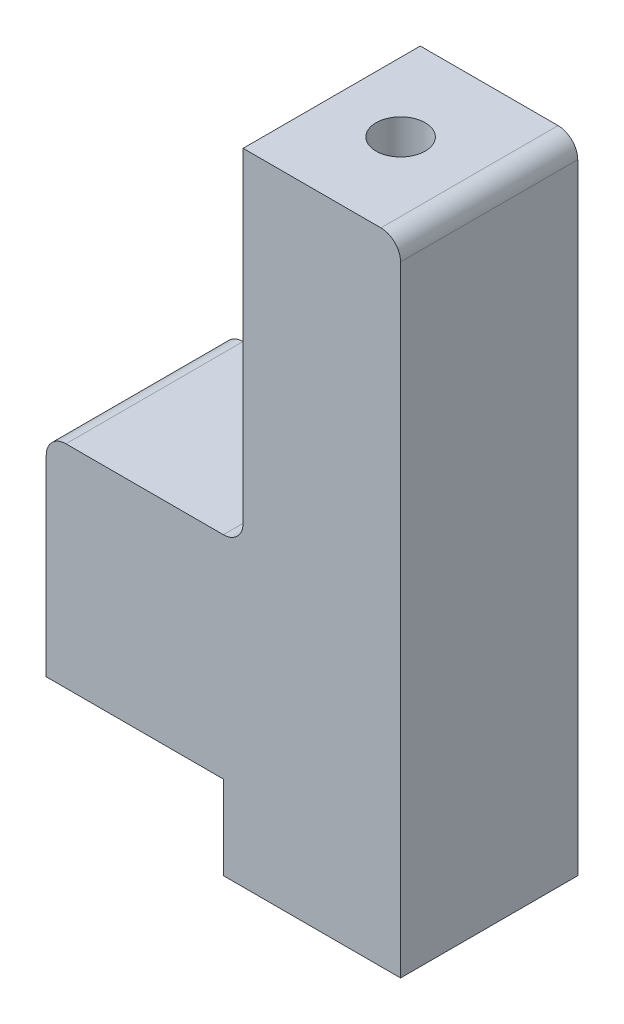
ISO-10303-21;
HEADER;
FILE_DESCRIPTION(('STEP AP214'),'2;1');
FILE_NAME('part.step','',(''),(''),'','','');
FILE_SCHEMA(('AUTOMOTIVE_DESIGN { 1 0 10303 214 1 1 1 1 }'));
ENDSEC;
DATA;
#1=APPLICATION_CONTEXT('core data for automotive mechanical design processes');
#2=APPLICATION_PROTOCOL_DEFINITION('international standard','automotive_design',2000,#1);
#3=PRODUCT_CONTEXT('',#1,'mechanical');
#4=PRODUCT('Part','Part','',(#3));
#5=PRODUCT_RELATED_PRODUCT_CATEGORY('part','',(#4));
#6=PRODUCT_DEFINITION_FORMATION('','',#4);
#7=PRODUCT_DEFINITION_CONTEXT('part definition',#1,'design');
#8=PRODUCT_DEFINITION('design','',#6,#7);
#9=PRODUCT_DEFINITION_SHAPE('','',#8);
#10=(LENGTH_UNIT() NAMED_UNIT(*) SI_UNIT(.MILLI.,.METRE.));
#11=(NAMED_UNIT(*) PLANE_ANGLE_UNIT() SI_UNIT($,.RADIAN.));
#12=(NAMED_UNIT(*) SI_UNIT($,.STERADIAN.) SOLID_ANGLE_UNIT());
#13=UNCERTAINTY_MEASURE_WITH_UNIT(LENGTH_MEASURE(1.E-05),#10,'distance_accuracy_value','');
#14=(GEOMETRIC_REPRESENTATION_CONTEXT(3) GLOBAL_UNCERTAINTY_ASSIGNED_CONTEXT((#13)) GLOBAL_UNIT_ASSIGNED_CONTEXT((#10,
#11,#12)) REPRESENTATION_CONTEXT('',''));
#15=CARTESIAN_POINT('',(0.,0.,0.));
#16=DIRECTION('',(0.,0.,1.));
#17=DIRECTION('',(1.,0.,0.));
#18=AXIS2_PLACEMENT_3D('',#15,#16,#17);
#19=CARTESIAN_POINT('',(-4.5,15.,4.5));
#20=DIRECTION('',(1.,0.,0.));
#21=DIRECTION('',(0.,0.,-1.));
#22=AXIS2_PLACEMENT_3D('',#19,#20,#21);
#23=PLANE('',#22);
#24=DIRECTION('',(0.,-1.,0.));
#25=VECTOR('',#24,1.);
#26=CARTESIAN_POINT('',(-4.5,15.,4.5));
#27=LINE('',#26,#25);
#28=CARTESIAN_POINT('',(-4.5,9.,4.5));
#29=VERTEX_POINT('',#28);
#30=CARTESIAN_POINT('',(-4.5,-0.75,4.5));
#31=VERTEX_POINT('',#30);
#32=EDGE_CURVE('E212',#29,#31,#27,.T.);
#33=ORIENTED_EDGE('',*,*,#32,.F.);
#34=DIRECTION('',(0.,0.,1.));
#35=VECTOR('',#34,1.);
#36=CARTESIAN_POINT('',(-4.5,9.,-4.5));
#37=LINE('',#36,#35);
#38=CARTESIAN_POINT('',(-4.5,9.,-4.5));
#39=VERTEX_POINT('',#38);
#40=EDGE_CURVE('E225',#29,#39,#37,.F.);
#41=ORIENTED_EDGE('',*,*,#40,.T.);
#42=DIRECTION('',(0.,-1.,0.));
#43=VECTOR('',#42,1.);
#44=CARTESIAN_POINT('',(-4.5,15.,-4.5));
#45=LINE('',#44,#43);
#46=CARTESIAN_POINT('',(-4.5,0.,-4.5));
#47=VERTEX_POINT('',#46);
#48=EDGE_CURVE('E214',#39,#47,#45,.T.);
#49=ORIENTED_EDGE('',*,*,#48,.T.);
#50=DIRECTION('',(0.,0.,1.));
#51=VECTOR('',#50,1.);
#52=CARTESIAN_POINT('',(-4.5,0.,4.5));
#53=LINE('',#52,#51);
#54=CARTESIAN_POINT('',(-4.5,0.,3.75));
#55=VERTEX_POINT('',#54);
#56=EDGE_CURVE('E209',#47,#55,#53,.T.);
#57=ORIENTED_EDGE('',*,*,#56,.T.);
#58=CARTESIAN_POINT('',(-4.5,-0.75,3.75));
#59=DIRECTION('',(-1.,0.,0.));
#60=DIRECTION('',(0.,0.,1.));
#61=AXIS2_PLACEMENT_3D('',#58,#59,#60);
#62=CIRCLE('',#61,0.75);
#63=EDGE_CURVE('E164',#31,#55,#62,.T.);
#64=ORIENTED_EDGE('',*,*,#63,.F.);
#65=EDGE_LOOP('',(#33,#41,#49,#57,#64));
#66=FACE_BOUND('',#65,.T.);
#67=ADVANCED_FACE('F37',(#66),#23,.F.);
#68=CARTESIAN_POINT('',(0.,0.,0.));
#69=DIRECTION('',(0.,-1.,0.));
#70=DIRECTION('',(0.,0.,-1.));
#71=AXIS2_PLACEMENT_3D('',#68,#69,#70);
#72=PLANE('',#71);
#73=DIRECTION('',(0.,0.,-1.));
#74=VECTOR('',#73,1.);
#75=CARTESIAN_POINT('',(4.5,0.,4.5));
#76=LINE('',#75,#74);
#77=CARTESIAN_POINT('',(4.5,0.,3.75));
#78=VERTEX_POINT('',#77);
#79=CARTESIAN_POINT('',(4.5,0.,-4.5));
#80=VERTEX_POINT('',#79);
#81=EDGE_CURVE('E202',#78,#80,#76,.T.);
#82=ORIENTED_EDGE('',*,*,#81,.F.);
#83=DIRECTION('',(-1.,0.,0.));
#84=VECTOR('',#83,1.);
#85=CARTESIAN_POINT('',(5.56066017177982,0.,3.75));
#86=LINE('',#85,#84);
#87=CARTESIAN_POINT('',(0.,0.,3.75));
#88=VERTEX_POINT('',#87);
#89=EDGE_CURVE('E169',#78,#88,#86,.T.);
#90=ORIENTED_EDGE('',*,*,#89,.T.);
#91=CARTESIAN_POINT('',(0.,0.,0.));
#92=DIRECTION('',(0.,-1.,0.));
#93=DIRECTION('',(0.,0.,-1.));
#94=AXIS2_PLACEMENT_3D('',#91,#92,#93);
#95=CIRCLE('',#94,3.75);
#96=EDGE_CURVE('E192',#88,#88,#95,.T.);
#97=ORIENTED_EDGE('',*,*,#96,.F.);
#98=EDGE_CURVE('E174',#88,#55,#86,.T.);
#99=ORIENTED_EDGE('',*,*,#98,.T.);
#100=ORIENTED_EDGE('',*,*,#56,.F.);
#101=DIRECTION('',(-1.,0.,0.));
#102=VECTOR('',#101,1.);
#103=CARTESIAN_POINT('',(-4.5,0.,-4.5));
#104=LINE('',#103,#102);
#105=EDGE_CURVE('E206',#80,#47,#104,.T.);
#106=ORIENTED_EDGE('',*,*,#105,.F.);
#107=EDGE_LOOP('',(#82,#90,#97,#99,#100,#106));
#108=FACE_BOUND('',#107,.T.);
#109=ADVANCED_FACE('F261',(#108),#72,.T.);
#110=CARTESIAN_POINT('',(4.5,-5.,-4.5));
#111=DIRECTION('',(-1.,0.,0.));
#112=DIRECTION('',(0.,0.,1.));
#113=AXIS2_PLACEMENT_3D('',#110,#111,#112);
#114=PLANE('',#113);
#115=DIRECTION('',(0.,1.,0.));
#116=VECTOR('',#115,1.);
#117=CARTESIAN_POINT('',(4.5,-5.,4.5));
#118=LINE('',#117,#116);
#119=CARTESIAN_POINT('',(4.5,-5.,4.5));
#120=VERTEX_POINT('',#119);
#121=CARTESIAN_POINT('',(4.5,-0.75,4.5));
#122=VERTEX_POINT('',#121);
#123=EDGE_CURVE('E188',#120,#122,#118,.T.);
#124=ORIENTED_EDGE('',*,*,#123,.T.);
#125=CARTESIAN_POINT('',(4.5,-0.75,3.75));
#126=DIRECTION('',(-1.,0.,0.));
#127=DIRECTION('',(0.,0.,1.));
#128=AXIS2_PLACEMENT_3D('',#125,#126,#127);
#129=CIRCLE('',#128,0.75);
#130=EDGE_CURVE('E166',#78,#122,#129,.F.);
#131=ORIENTED_EDGE('',*,*,#130,.F.);
#132=ORIENTED_EDGE('',*,*,#81,.T.);
#133=DIRECTION('',(0.,1.,0.));
#134=VECTOR('',#133,1.);
#135=CARTESIAN_POINT('',(4.5,-5.,-4.5));
#136=LINE('',#135,#134);
#137=CARTESIAN_POINT('',(4.5,-5.,-4.5));
#138=VERTEX_POINT('',#137);
#139=EDGE_CURVE('E189',#138,#80,#136,.T.);
#140=ORIENTED_EDGE('',*,*,#139,.F.);
#141=DIRECTION('',(0.,0.,1.));
#142=VECTOR('',#141,1.);
#143=CARTESIAN_POINT('',(4.5,-5.,-4.5));
#144=LINE('',#143,#142);
#145=EDGE_CURVE('E168',#138,#120,#144,.T.);
#146=ORIENTED_EDGE('',*,*,#145,.T.);
#147=EDGE_LOOP('',(#124,#131,#132,#140,#146));
#148=FACE_BOUND('',#147,.T.);
#149=ADVANCED_FACE('F284',(#148),#114,.T.);
#150=CARTESIAN_POINT('',(-4.5,15.,-4.5));
#151=DIRECTION('',(0.,0.,1.));
#152=DIRECTION('',(1.,0.,0.));
#153=AXIS2_PLACEMENT_3D('',#150,#151,#152);
#154=PLANE('',#153);
#155=DIRECTION('',(-1.,0.,0.));
#156=VECTOR('',#155,1.);
#157=CARTESIAN_POINT('',(5.5,27.5,-4.5));
#158=LINE('',#157,#156);
#159=CARTESIAN_POINT('',(12.5,27.5,-4.5));
#160=VERTEX_POINT('',#159);
#161=CARTESIAN_POINT('',(5.5,27.5,-4.5));
#162=VERTEX_POINT('',#161);
#163=EDGE_CURVE('E147',#160,#162,#158,.T.);
#164=ORIENTED_EDGE('',*,*,#163,.F.);
#165=CARTESIAN_POINT('',(12.5,26.5,-4.5));
#166=DIRECTION('',(0.,0.,1.));
#167=DIRECTION('',(1.,0.,0.));
#168=AXIS2_PLACEMENT_3D('',#165,#166,#167);
#169=CIRCLE('',#168,1.);
#170=CARTESIAN_POINT('',(13.5,26.5,-4.5));
#171=VERTEX_POINT('',#170);
#172=EDGE_CURVE('E59',#160,#171,#169,.F.);
#173=ORIENTED_EDGE('',*,*,#172,.T.);
#174=DIRECTION('',(0.,1.,0.));
#175=VECTOR('',#174,1.);
#176=CARTESIAN_POINT('',(13.5,-5.,-4.5));
#177=LINE('',#176,#175);
#178=CARTESIAN_POINT('',(13.5,-5.,-4.5));
#179=VERTEX_POINT('',#178);
#180=EDGE_CURVE('E193',#179,#171,#177,.T.);
#181=ORIENTED_EDGE('',*,*,#180,.F.);
#182=DIRECTION('',(-1.,0.,0.));
#183=VECTOR('',#182,1.);
#184=CARTESIAN_POINT('',(4.5,-5.,-4.5));
#185=LINE('',#184,#183);
#186=EDGE_CURVE('E185',#179,#138,#185,.T.);
#187=ORIENTED_EDGE('',*,*,#186,.T.);
#188=ORIENTED_EDGE('',*,*,#139,.T.);
#189=ORIENTED_EDGE('',*,*,#105,.T.);
#190=ORIENTED_EDGE('',*,*,#48,.F.);
#191=CARTESIAN_POINT('',(-3.5,9.,-4.5));
#192=DIRECTION('',(0.,0.,1.));
#193=DIRECTION('',(1.,0.,0.));
#194=AXIS2_PLACEMENT_3D('',#191,#192,#193);
#195=CIRCLE('',#194,1.);
#196=CARTESIAN_POINT('',(-3.5,10.,-4.5));
#197=VERTEX_POINT('',#196);
#198=EDGE_CURVE('E227',#39,#197,#195,.F.);
#199=ORIENTED_EDGE('',*,*,#198,.T.);
#200=DIRECTION('',(-1.,0.,0.));
#201=VECTOR('',#200,1.);
#202=CARTESIAN_POINT('',(-4.5,10.,-4.5));
#203=LINE('',#202,#201);
#204=CARTESIAN_POINT('',(4.5,10.,-4.5));
#205=VERTEX_POINT('',#204);
#206=EDGE_CURVE('E138',#205,#197,#203,.T.);
#207=ORIENTED_EDGE('',*,*,#206,.F.);
#208=CARTESIAN_POINT('',(4.5,11.,-4.5));
#209=DIRECTION('',(0.,0.,1.));
#210=DIRECTION('',(1.,0.,0.));
#211=AXIS2_PLACEMENT_3D('',#208,#209,#210);
#212=CIRCLE('',#211,1.);
#213=CARTESIAN_POINT('',(5.5,11.,-4.5));
#214=VERTEX_POINT('',#213);
#215=EDGE_CURVE('E229',#205,#214,#212,.T.);
#216=ORIENTED_EDGE('',*,*,#215,.T.);
#217=DIRECTION('',(0.,1.,0.));
#218=VECTOR('',#217,1.);
#219=CARTESIAN_POINT('',(5.5,10.,-4.5));
#220=LINE('',#219,#218);
#221=EDGE_CURVE('E137',#214,#162,#220,.T.);
#222=ORIENTED_EDGE('',*,*,#221,.T.);
#223=EDGE_LOOP('',(#164,#173,#181,#187,#188,#189,#190,#199,#207,#216,#222));
#224=FACE_BOUND('',#223,.T.);
#225=ADVANCED_FACE('F236',(#224),#154,.F.);
#226=CARTESIAN_POINT('',(-4.5,15.,4.5));
#227=DIRECTION('',(0.,0.,-1.));
#228=DIRECTION('',(-1.,0.,0.));
#229=AXIS2_PLACEMENT_3D('',#226,#227,#228);
#230=PLANE('',#229);
#231=DIRECTION('',(0.,1.,0.));
#232=VECTOR('',#231,1.);
#233=CARTESIAN_POINT('',(13.5,-5.,4.5));
#234=LINE('',#233,#232);
#235=CARTESIAN_POINT('',(13.5,-5.,4.5));
#236=VERTEX_POINT('',#235);
#237=CARTESIAN_POINT('',(13.5,26.5,4.5));
#238=VERTEX_POINT('',#237);
#239=EDGE_CURVE('E195',#236,#238,#234,.T.);
#240=ORIENTED_EDGE('',*,*,#239,.T.);
#241=CARTESIAN_POINT('',(12.5,26.5,4.5));
#242=DIRECTION('',(0.,0.,-1.));
#243=DIRECTION('',(-1.,0.,0.));
#244=AXIS2_PLACEMENT_3D('',#241,#242,#243);
#245=CIRCLE('',#244,1.);
#246=CARTESIAN_POINT('',(12.5,27.5,4.5));
#247=VERTEX_POINT('',#246);
#248=EDGE_CURVE('E11',#238,#247,#245,.F.);
#249=ORIENTED_EDGE('',*,*,#248,.T.);
#250=DIRECTION('',(1.,0.,0.));
#251=VECTOR('',#250,1.);
#252=CARTESIAN_POINT('',(5.5,27.5,4.5));
#253=LINE('',#252,#251);
#254=CARTESIAN_POINT('',(5.5,27.5,4.5));
#255=VERTEX_POINT('',#254);
#256=EDGE_CURVE('E141',#255,#247,#253,.T.);
#257=ORIENTED_EDGE('',*,*,#256,.F.);
#258=DIRECTION('',(0.,1.,0.));
#259=VECTOR('',#258,1.);
#260=CARTESIAN_POINT('',(5.5,10.,4.5));
#261=LINE('',#260,#259);
#262=CARTESIAN_POINT('',(5.5,11.,4.5));
#263=VERTEX_POINT('',#262);
#264=EDGE_CURVE('E127',#263,#255,#261,.T.);
#265=ORIENTED_EDGE('',*,*,#264,.F.);
#266=CARTESIAN_POINT('',(4.5,11.,4.5));
#267=DIRECTION('',(0.,0.,-1.));
#268=DIRECTION('',(-1.,0.,0.));
#269=AXIS2_PLACEMENT_3D('',#266,#267,#268);
#270=CIRCLE('',#269,1.);
#271=CARTESIAN_POINT('',(4.5,10.,4.5));
#272=VERTEX_POINT('',#271);
#273=EDGE_CURVE('E231',#263,#272,#270,.T.);
#274=ORIENTED_EDGE('',*,*,#273,.T.);
#275=DIRECTION('',(1.,0.,0.));
#276=VECTOR('',#275,1.);
#277=CARTESIAN_POINT('',(-4.5,10.,4.5));
#278=LINE('',#277,#276);
#279=CARTESIAN_POINT('',(-3.5,10.,4.5));
#280=VERTEX_POINT('',#279);
#281=EDGE_CURVE('E159',#280,#272,#278,.T.);
#282=ORIENTED_EDGE('',*,*,#281,.F.);
#283=CARTESIAN_POINT('',(-3.5,9.,4.5));
#284=DIRECTION('',(0.,0.,-1.));
#285=DIRECTION('',(-1.,0.,0.));
#286=AXIS2_PLACEMENT_3D('',#283,#284,#285);
#287=CIRCLE('',#286,1.);
#288=EDGE_CURVE('E223',#280,#29,#287,.F.);
#289=ORIENTED_EDGE('',*,*,#288,.T.);
#290=ORIENTED_EDGE('',*,*,#32,.T.);
#291=DIRECTION('',(-1.,0.,0.));
#292=VECTOR('',#291,1.);
#293=CARTESIAN_POINT('',(5.56066017177982,-0.75,4.5));
#294=LINE('',#293,#292);
#295=EDGE_CURVE('E171',#122,#31,#294,.T.);
#296=ORIENTED_EDGE('',*,*,#295,.F.);
#297=ORIENTED_EDGE('',*,*,#123,.F.);
#298=DIRECTION('',(1.,0.,0.));
#299=VECTOR('',#298,1.);
#300=CARTESIAN_POINT('',(4.5,-5.,4.5));
#301=LINE('',#300,#299);
#302=EDGE_CURVE('E179',#120,#236,#301,.T.);
#303=ORIENTED_EDGE('',*,*,#302,.T.);
#304=EDGE_LOOP('',(#240,#249,#257,#265,#274,#282,#289,#290,#296,#297,#303));
#305=FACE_BOUND('',#304,.T.);
#306=ADVANCED_FACE('F142',(#305),#230,.F.);
#307=CARTESIAN_POINT('',(0.,5.,0.));
#308=DIRECTION('',(0.,-1.,0.));
#309=DIRECTION('',(0.,0.,-1.));
#310=AXIS2_PLACEMENT_3D('',#307,#308,#309);
#311=CYLINDRICAL_SURFACE('',#310,3.75);
#312=CARTESIAN_POINT('',(0.,5.,0.));
#313=DIRECTION('',(0.,-1.,0.));
#314=DIRECTION('',(0.,0.,-1.));
#315=AXIS2_PLACEMENT_3D('',#312,#313,#314);
#316=CIRCLE('',#315,3.75);
#317=CARTESIAN_POINT('',(0.,5.,-3.75));
#318=VERTEX_POINT('',#317);
#319=EDGE_CURVE('E199',#318,#318,#316,.T.);
#320=ORIENTED_EDGE('',*,*,#319,.F.);
#321=EDGE_LOOP('',(#320));
#322=FACE_BOUND('',#321,.T.);
#323=ORIENTED_EDGE('',*,*,#96,.T.);
#324=EDGE_LOOP('',(#323));
#325=FACE_BOUND('',#324,.T.);
#326=ADVANCED_FACE('F264',(#322,#325),#311,.F.);
#327=CARTESIAN_POINT('',(0.,5.,0.));
#328=DIRECTION('',(0.,-1.,0.));
#329=DIRECTION('',(0.,0.,-1.));
#330=AXIS2_PLACEMENT_3D('',#327,#328,#329);
#331=PLANE('',#330);
#332=ORIENTED_EDGE('',*,*,#319,.T.);
#333=EDGE_LOOP('',(#332));
#334=FACE_BOUND('',#333,.T.);
#335=ADVANCED_FACE('F266',(#334),#331,.T.);
#336=CARTESIAN_POINT('',(13.5,-5.,-4.5));
#337=DIRECTION('',(1.,0.,0.));
#338=DIRECTION('',(0.,0.,-1.));
#339=AXIS2_PLACEMENT_3D('',#336,#337,#338);
#340=PLANE('',#339);
#341=ORIENTED_EDGE('',*,*,#180,.T.);
#342=DIRECTION('',(0.,0.,-1.));
#343=VECTOR('',#342,1.);
#344=CARTESIAN_POINT('',(13.5,26.5,-4.5));
#345=LINE('',#344,#343);
#346=EDGE_CURVE('E45',#171,#238,#345,.F.);
#347=ORIENTED_EDGE('',*,*,#346,.T.);
#348=ORIENTED_EDGE('',*,*,#239,.F.);
#349=DIRECTION('',(0.,0.,-1.));
#350=VECTOR('',#349,1.);
#351=CARTESIAN_POINT('',(13.5,-5.,-4.5));
#352=LINE('',#351,#350);
#353=EDGE_CURVE('E182',#236,#179,#352,.T.);
#354=ORIENTED_EDGE('',*,*,#353,.T.);
#355=EDGE_LOOP('',(#341,#347,#348,#354));
#356=FACE_BOUND('',#355,.T.);
#357=ADVANCED_FACE('F273',(#356),#340,.T.);
#358=CARTESIAN_POINT('',(0.,-5.,0.));
#359=DIRECTION('',(0.,1.,0.));
#360=DIRECTION('',(0.,0.,1.));
#361=AXIS2_PLACEMENT_3D('',#358,#359,#360);
#362=PLANE('',#361);
#363=CARTESIAN_POINT('',(9.,-5.,0.));
#364=DIRECTION('',(0.,-1.,0.));
#365=DIRECTION('',(0.,0.,-1.));
#366=AXIS2_PLACEMENT_3D('',#363,#364,#365);
#367=CIRCLE('',#366,1.25);
#368=CARTESIAN_POINT('',(9.,-5.,-1.25));
#369=VERTEX_POINT('',#368);
#370=EDGE_CURVE('E154',#369,#369,#367,.T.);
#371=ORIENTED_EDGE('',*,*,#370,.F.);
#372=EDGE_LOOP('',(#371));
#373=FACE_BOUND('',#372,.T.);
#374=ORIENTED_EDGE('',*,*,#145,.F.);
#375=ORIENTED_EDGE('',*,*,#186,.F.);
#376=ORIENTED_EDGE('',*,*,#353,.F.);
#377=ORIENTED_EDGE('',*,*,#302,.F.);
#378=EDGE_LOOP('',(#374,#375,#376,#377));
#379=FACE_BOUND('',#378,.T.);
#380=ADVANCED_FACE('F308',(#373,#379),#362,.F.);
#381=CARTESIAN_POINT('',(5.56066017177982,-0.75,3.75));
#382=DIRECTION('',(-1.,0.,0.));
#383=DIRECTION('',(0.,0.,1.));
#384=AXIS2_PLACEMENT_3D('',#381,#382,#383);
#385=CYLINDRICAL_SURFACE('',#384,0.75);
#386=ORIENTED_EDGE('',*,*,#89,.F.);
#387=ORIENTED_EDGE('',*,*,#130,.T.);
#388=ORIENTED_EDGE('',*,*,#295,.T.);
#389=ORIENTED_EDGE('',*,*,#63,.T.);
#390=ORIENTED_EDGE('',*,*,#98,.F.);
#391=EDGE_LOOP('',(#386,#387,#388,#389,#390));
#392=FACE_BOUND('',#391,.T.);
#393=ADVANCED_FACE('F257',(#392),#385,.F.);
#394=CARTESIAN_POINT('',(5.5,10.,-4.5));
#395=DIRECTION('',(1.,0.,0.));
#396=DIRECTION('',(0.,0.,-1.));
#397=AXIS2_PLACEMENT_3D('',#394,#395,#396);
#398=PLANE('',#397);
#399=ORIENTED_EDGE('',*,*,#221,.F.);
#400=DIRECTION('',(0.,0.,-1.));
#401=VECTOR('',#400,1.);
#402=CARTESIAN_POINT('',(5.5,11.,-4.5));
#403=LINE('',#402,#401);
#404=EDGE_CURVE('E134',#214,#263,#403,.F.);
#405=ORIENTED_EDGE('',*,*,#404,.T.);
#406=ORIENTED_EDGE('',*,*,#264,.T.);
#407=DIRECTION('',(0.,0.,1.));
#408=VECTOR('',#407,1.);
#409=CARTESIAN_POINT('',(5.5,27.5,-4.5));
#410=LINE('',#409,#408);
#411=EDGE_CURVE('E132',#162,#255,#410,.T.);
#412=ORIENTED_EDGE('',*,*,#411,.F.);
#413=EDGE_LOOP('',(#399,#405,#406,#412));
#414=FACE_BOUND('',#413,.T.);
#415=ADVANCED_FACE('F130',(#414),#398,.F.);
#416=CARTESIAN_POINT('',(0.,10.,0.));
#417=DIRECTION('',(0.,1.,0.));
#418=DIRECTION('',(0.,0.,1.));
#419=AXIS2_PLACEMENT_3D('',#416,#417,#418);
#420=PLANE('',#419);
#421=ORIENTED_EDGE('',*,*,#281,.T.);
#422=DIRECTION('',(0.,0.,-1.));
#423=VECTOR('',#422,1.);
#424=CARTESIAN_POINT('',(4.5,10.,0.));
#425=LINE('',#424,#423);
#426=EDGE_CURVE('E219',#272,#205,#425,.T.);
#427=ORIENTED_EDGE('',*,*,#426,.T.);
#428=ORIENTED_EDGE('',*,*,#206,.T.);
#429=DIRECTION('',(0.,0.,1.));
#430=VECTOR('',#429,1.);
#431=CARTESIAN_POINT('',(-3.5,10.,4.5));
#432=LINE('',#431,#430);
#433=EDGE_CURVE('E216',#197,#280,#432,.T.);
#434=ORIENTED_EDGE('',*,*,#433,.T.);
#435=EDGE_LOOP('',(#421,#427,#428,#434));
#436=FACE_BOUND('',#435,.T.);
#437=ADVANCED_FACE('F243',(#436),#420,.T.);
#438=CARTESIAN_POINT('',(4.5,11.,0.));
#439=DIRECTION('',(0.,0.,-1.));
#440=DIRECTION('',(-1.,0.,0.));
#441=AXIS2_PLACEMENT_3D('',#438,#439,#440);
#442=CYLINDRICAL_SURFACE('',#441,1.);
#443=ORIENTED_EDGE('',*,*,#273,.F.);
#444=ORIENTED_EDGE('',*,*,#404,.F.);
#445=ORIENTED_EDGE('',*,*,#215,.F.);
#446=ORIENTED_EDGE('',*,*,#426,.F.);
#447=EDGE_LOOP('',(#443,#444,#445,#446));
#448=FACE_BOUND('',#447,.T.);
#449=ADVANCED_FACE('F239',(#448),#442,.F.);
#450=CARTESIAN_POINT('',(-3.5,9.,0.));
#451=DIRECTION('',(0.,0.,-1.));
#452=DIRECTION('',(-1.,0.,0.));
#453=AXIS2_PLACEMENT_3D('',#450,#451,#452);
#454=CYLINDRICAL_SURFACE('',#453,1.);
#455=ORIENTED_EDGE('',*,*,#198,.F.);
#456=ORIENTED_EDGE('',*,*,#40,.F.);
#457=ORIENTED_EDGE('',*,*,#288,.F.);
#458=ORIENTED_EDGE('',*,*,#433,.F.);
#459=EDGE_LOOP('',(#455,#456,#457,#458));
#460=FACE_BOUND('',#459,.T.);
#461=ADVANCED_FACE('F247',(#460),#454,.T.);
#462=CARTESIAN_POINT('',(0.,27.5,0.));
#463=DIRECTION('',(0.,1.,0.));
#464=DIRECTION('',(0.,0.,1.));
#465=AXIS2_PLACEMENT_3D('',#462,#463,#464);
#466=PLANE('',#465);
#467=CARTESIAN_POINT('',(9.,27.5,0.));
#468=DIRECTION('',(0.,-1.,0.));
#469=DIRECTION('',(0.,0.,-1.));
#470=AXIS2_PLACEMENT_3D('',#467,#468,#469);
#471=CIRCLE('',#470,1.25);
#472=CARTESIAN_POINT('',(9.,27.5,-1.25));
#473=VERTEX_POINT('',#472);
#474=EDGE_CURVE('E151',#473,#473,#471,.T.);
#475=ORIENTED_EDGE('',*,*,#474,.T.);
#476=EDGE_LOOP('',(#475));
#477=FACE_BOUND('',#476,.T.);
#478=ORIENTED_EDGE('',*,*,#256,.T.);
#479=DIRECTION('',(0.,0.,-1.));
#480=VECTOR('',#479,1.);
#481=CARTESIAN_POINT('',(12.5,27.5,0.));
#482=LINE('',#481,#480);
#483=EDGE_CURVE('E233',#247,#160,#482,.T.);
#484=ORIENTED_EDGE('',*,*,#483,.T.);
#485=ORIENTED_EDGE('',*,*,#163,.T.);
#486=ORIENTED_EDGE('',*,*,#411,.T.);
#487=EDGE_LOOP('',(#478,#484,#485,#486));
#488=FACE_BOUND('',#487,.T.);
#489=ADVANCED_FACE('F149',(#477,#488),#466,.T.);
#490=CARTESIAN_POINT('',(9.,27.5,0.));
#491=DIRECTION('',(0.,-1.,0.));
#492=DIRECTION('',(0.,0.,-1.));
#493=AXIS2_PLACEMENT_3D('',#490,#491,#492);
#494=CYLINDRICAL_SURFACE('',#493,1.25);
#495=ORIENTED_EDGE('',*,*,#474,.F.);
#496=EDGE_LOOP('',(#495));
#497=FACE_BOUND('',#496,.T.);
#498=ORIENTED_EDGE('',*,*,#370,.T.);
#499=EDGE_LOOP('',(#498));
#500=FACE_BOUND('',#499,.T.);
#501=ADVANCED_FACE('F293',(#497,#500),#494,.F.);
#502=CARTESIAN_POINT('',(12.5,26.5,0.));
#503=DIRECTION('',(0.,0.,-1.));
#504=DIRECTION('',(-1.,0.,0.));
#505=AXIS2_PLACEMENT_3D('',#502,#503,#504);
#506=CYLINDRICAL_SURFACE('',#505,1.);
#507=ORIENTED_EDGE('',*,*,#248,.F.);
#508=ORIENTED_EDGE('',*,*,#346,.F.);
#509=ORIENTED_EDGE('',*,*,#172,.F.);
#510=ORIENTED_EDGE('',*,*,#483,.F.);
#511=EDGE_LOOP('',(#507,#508,#509,#510));
#512=FACE_BOUND('',#511,.T.);
#513=ADVANCED_FACE('F39',(#512),#506,.T.);
#514=CLOSED_SHELL('',(#67,#109,#149,#225,#306,#326,#335,#357,#380,#393,#415,#437,#449,#461,#489,
#501,#513));
#515=MANIFOLD_SOLID_BREP('B2',#514);
#516=ADVANCED_BREP_SHAPE_REPRESENTATION('',(#18,#515),#14);
#517=SHAPE_DEFINITION_REPRESENTATION(#9,#516);
ENDSEC;
END-ISO-10303-21;
